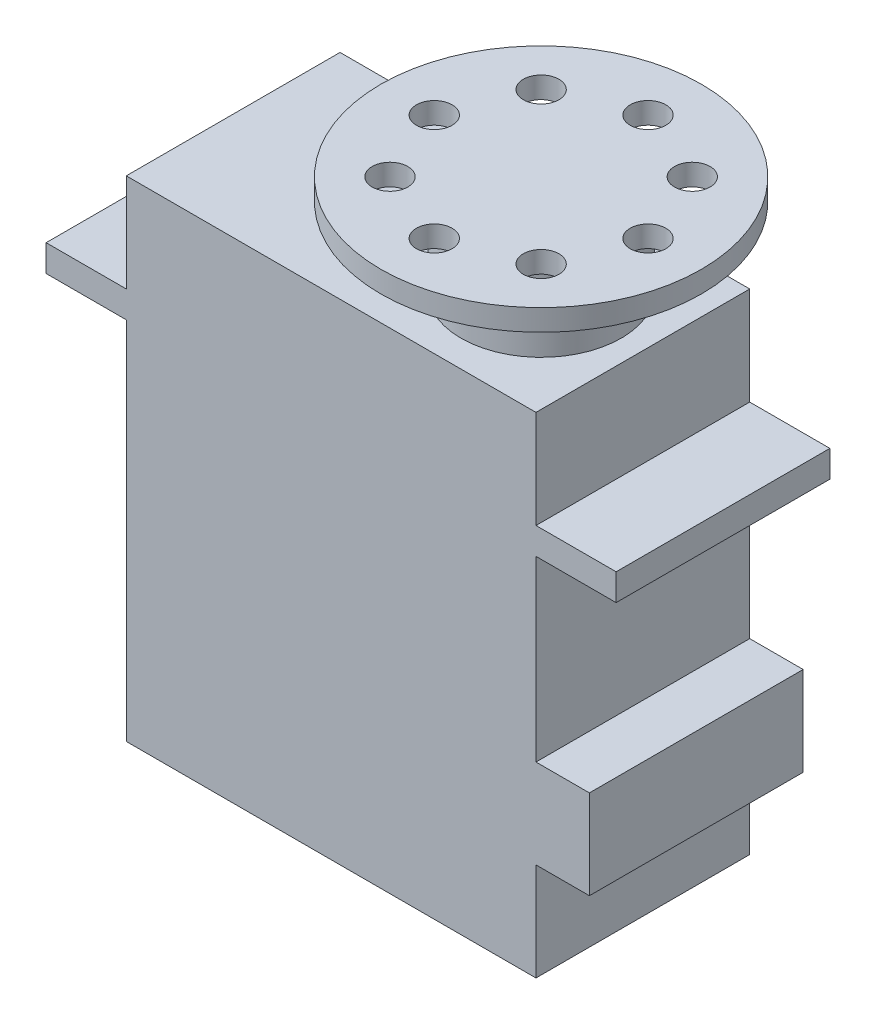
ISO-10303-21;
HEADER;
FILE_DESCRIPTION(('STEP AP214'),'2;1');
FILE_NAME('part.step','',(''),(''),'','','');
FILE_SCHEMA(('AUTOMOTIVE_DESIGN { 1 0 10303 214 1 1 1 1 }'));
ENDSEC;
DATA;
#1=APPLICATION_CONTEXT('core data for automotive mechanical design processes');
#2=APPLICATION_PROTOCOL_DEFINITION('international standard','automotive_design',2000,#1);
#3=PRODUCT_CONTEXT('',#1,'mechanical');
#4=PRODUCT('Part','Part','',(#3));
#5=PRODUCT_RELATED_PRODUCT_CATEGORY('part','',(#4));
#6=PRODUCT_DEFINITION_FORMATION('','',#4);
#7=PRODUCT_DEFINITION_CONTEXT('part definition',#1,'design');
#8=PRODUCT_DEFINITION('design','',#6,#7);
#9=PRODUCT_DEFINITION_SHAPE('','',#8);
#10=(LENGTH_UNIT() NAMED_UNIT(*) SI_UNIT(.MILLI.,.METRE.));
#11=(NAMED_UNIT(*) PLANE_ANGLE_UNIT() SI_UNIT($,.RADIAN.));
#12=(NAMED_UNIT(*) SI_UNIT($,.STERADIAN.) SOLID_ANGLE_UNIT());
#13=UNCERTAINTY_MEASURE_WITH_UNIT(LENGTH_MEASURE(1.E-05),#10,'distance_accuracy_value','');
#14=(GEOMETRIC_REPRESENTATION_CONTEXT(3) GLOBAL_UNCERTAINTY_ASSIGNED_CONTEXT((#13)) GLOBAL_UNIT_ASSIGNED_CONTEXT((#10,
#11,#12)) REPRESENTATION_CONTEXT('',''));
#15=CARTESIAN_POINT('',(0.,0.,0.));
#16=DIRECTION('',(0.,0.,1.));
#17=DIRECTION('',(1.,0.,0.));
#18=AXIS2_PLACEMENT_3D('',#15,#16,#17);
#19=CARTESIAN_POINT('',(11.5,13.75,-6.));
#20=DIRECTION('',(1.,0.,0.));
#21=DIRECTION('',(0.,0.,-1.));
#22=AXIS2_PLACEMENT_3D('',#19,#20,#21);
#23=PLANE('',#22);
#24=DIRECTION('',(0.,1.,0.));
#25=VECTOR('',#24,1.);
#26=CARTESIAN_POINT('',(11.5,13.75,-6.));
#27=LINE('',#26,#25);
#28=CARTESIAN_POINT('',(11.5,-13.75,-6.));
#29=VERTEX_POINT('',#28);
#30=CARTESIAN_POINT('',(11.5,-8.25,-6.));
#31=VERTEX_POINT('',#30);
#32=EDGE_CURVE('E358',#29,#31,#27,.T.);
#33=ORIENTED_EDGE('',*,*,#32,.T.);
#34=DIRECTION('',(0.,0.,-1.));
#35=VECTOR('',#34,1.);
#36=CARTESIAN_POINT('',(11.5,-8.25,6.));
#37=LINE('',#36,#35);
#38=CARTESIAN_POINT('',(11.5,-8.25,6.));
#39=VERTEX_POINT('',#38);
#40=EDGE_CURVE('E627',#39,#31,#37,.T.);
#41=ORIENTED_EDGE('',*,*,#40,.F.);
#42=DIRECTION('',(0.,1.,0.));
#43=VECTOR('',#42,1.);
#44=CARTESIAN_POINT('',(11.5,13.75,6.));
#45=LINE('',#44,#43);
#46=CARTESIAN_POINT('',(11.5,-13.75,6.));
#47=VERTEX_POINT('',#46);
#48=EDGE_CURVE('E185',#47,#39,#45,.T.);
#49=ORIENTED_EDGE('',*,*,#48,.F.);
#50=DIRECTION('',(0.,0.,1.));
#51=VECTOR('',#50,1.);
#52=CARTESIAN_POINT('',(11.5,-13.75,-6.));
#53=LINE('',#52,#51);
#54=EDGE_CURVE('E54',#29,#47,#53,.T.);
#55=ORIENTED_EDGE('',*,*,#54,.F.);
#56=EDGE_LOOP('',(#33,#41,#49,#55));
#57=FACE_BOUND('',#56,.T.);
#58=ADVANCED_FACE('F45',(#57),#23,.T.);
#59=CARTESIAN_POINT('',(11.5,-3.25,6.));
#60=VERTEX_POINT('',#59);
#61=CARTESIAN_POINT('',(11.5,6.75,6.));
#62=VERTEX_POINT('',#61);
#63=EDGE_CURVE('E345',#60,#62,#45,.T.);
#64=ORIENTED_EDGE('',*,*,#63,.F.);
#65=DIRECTION('',(0.,0.,1.));
#66=VECTOR('',#65,1.);
#67=CARTESIAN_POINT('',(11.5,-3.25,6.));
#68=LINE('',#67,#66);
#69=CARTESIAN_POINT('',(11.5,-3.25,-6.));
#70=VERTEX_POINT('',#69);
#71=EDGE_CURVE('E179',#70,#60,#68,.T.);
#72=ORIENTED_EDGE('',*,*,#71,.F.);
#73=CARTESIAN_POINT('',(11.5,6.75,-6.));
#74=VERTEX_POINT('',#73);
#75=EDGE_CURVE('E363',#70,#74,#27,.T.);
#76=ORIENTED_EDGE('',*,*,#75,.T.);
#77=DIRECTION('',(0.,0.,1.));
#78=VECTOR('',#77,1.);
#79=CARTESIAN_POINT('',(11.5,6.75,-6.));
#80=LINE('',#79,#78);
#81=EDGE_CURVE('E191',#74,#62,#80,.T.);
#82=ORIENTED_EDGE('',*,*,#81,.T.);
#83=EDGE_LOOP('',(#64,#72,#76,#82));
#84=FACE_BOUND('',#83,.T.);
#85=ADVANCED_FACE('F432',(#84),#23,.T.);
#86=CARTESIAN_POINT('',(11.5,8.25,6.));
#87=VERTEX_POINT('',#86);
#88=CARTESIAN_POINT('',(11.5,13.75,6.));
#89=VERTEX_POINT('',#88);
#90=EDGE_CURVE('E340',#87,#89,#45,.T.);
#91=ORIENTED_EDGE('',*,*,#90,.F.);
#92=DIRECTION('',(0.,0.,-1.));
#93=VECTOR('',#92,1.);
#94=CARTESIAN_POINT('',(11.5,8.25,6.));
#95=LINE('',#94,#93);
#96=CARTESIAN_POINT('',(11.5,8.25,-6.));
#97=VERTEX_POINT('',#96);
#98=EDGE_CURVE('E187',#87,#97,#95,.T.);
#99=ORIENTED_EDGE('',*,*,#98,.T.);
#100=CARTESIAN_POINT('',(11.5,13.75,-6.));
#101=VERTEX_POINT('',#100);
#102=EDGE_CURVE('E357',#97,#101,#27,.T.);
#103=ORIENTED_EDGE('',*,*,#102,.T.);
#104=DIRECTION('',(0.,0.,1.));
#105=VECTOR('',#104,1.);
#106=CARTESIAN_POINT('',(11.5,13.75,-6.));
#107=LINE('',#106,#105);
#108=EDGE_CURVE('E48',#101,#89,#107,.T.);
#109=ORIENTED_EDGE('',*,*,#108,.T.);
#110=EDGE_LOOP('',(#91,#99,#103,#109));
#111=FACE_BOUND('',#110,.T.);
#112=ADVANCED_FACE('F389',(#111),#23,.T.);
#113=CARTESIAN_POINT('',(-11.5,13.75,-6.));
#114=DIRECTION('',(-1.,0.,0.));
#115=DIRECTION('',(0.,0.,1.));
#116=AXIS2_PLACEMENT_3D('',#113,#114,#115);
#117=PLANE('',#116);
#118=DIRECTION('',(0.,0.,-1.));
#119=VECTOR('',#118,1.);
#120=CARTESIAN_POINT('',(-11.5,8.25,6.));
#121=LINE('',#120,#119);
#122=CARTESIAN_POINT('',(-11.5,8.25,6.));
#123=VERTEX_POINT('',#122);
#124=CARTESIAN_POINT('',(-11.5,8.25,-6.));
#125=VERTEX_POINT('',#124);
#126=EDGE_CURVE('E234',#123,#125,#121,.T.);
#127=ORIENTED_EDGE('',*,*,#126,.F.);
#128=DIRECTION('',(0.,-1.,0.));
#129=VECTOR('',#128,1.);
#130=CARTESIAN_POINT('',(-11.5,13.75,6.));
#131=LINE('',#130,#129);
#132=CARTESIAN_POINT('',(-11.5,13.75,6.));
#133=VERTEX_POINT('',#132);
#134=EDGE_CURVE('E350',#133,#123,#131,.T.);
#135=ORIENTED_EDGE('',*,*,#134,.F.);
#136=DIRECTION('',(0.,0.,1.));
#137=VECTOR('',#136,1.);
#138=CARTESIAN_POINT('',(-11.5,13.75,-6.));
#139=LINE('',#138,#137);
#140=CARTESIAN_POINT('',(-11.5,13.75,-6.));
#141=VERTEX_POINT('',#140);
#142=EDGE_CURVE('E380',#141,#133,#139,.T.);
#143=ORIENTED_EDGE('',*,*,#142,.F.);
#144=DIRECTION('',(0.,-1.,0.));
#145=VECTOR('',#144,1.);
#146=CARTESIAN_POINT('',(-11.5,13.75,-6.));
#147=LINE('',#146,#145);
#148=EDGE_CURVE('E368',#141,#125,#147,.T.);
#149=ORIENTED_EDGE('',*,*,#148,.T.);
#150=EDGE_LOOP('',(#127,#135,#143,#149));
#151=FACE_BOUND('',#150,.T.);
#152=ADVANCED_FACE('F396',(#151),#117,.T.);
#153=CARTESIAN_POINT('',(11.5,-13.75,-6.));
#154=DIRECTION('',(0.,-1.,0.));
#155=DIRECTION('',(0.,0.,-1.));
#156=AXIS2_PLACEMENT_3D('',#153,#154,#155);
#157=PLANE('',#156);
#158=ORIENTED_EDGE('',*,*,#54,.T.);
#159=DIRECTION('',(1.,0.,0.));
#160=VECTOR('',#159,1.);
#161=CARTESIAN_POINT('',(11.5,-13.75,6.));
#162=LINE('',#161,#160);
#163=CARTESIAN_POINT('',(-11.5,-13.75,6.));
#164=VERTEX_POINT('',#163);
#165=EDGE_CURVE('E354',#164,#47,#162,.T.);
#166=ORIENTED_EDGE('',*,*,#165,.F.);
#167=DIRECTION('',(0.,0.,1.));
#168=VECTOR('',#167,1.);
#169=CARTESIAN_POINT('',(-11.5,-13.75,-6.));
#170=LINE('',#169,#168);
#171=CARTESIAN_POINT('',(-11.5,-13.75,-6.));
#172=VERTEX_POINT('',#171);
#173=EDGE_CURVE('E377',#172,#164,#170,.T.);
#174=ORIENTED_EDGE('',*,*,#173,.F.);
#175=DIRECTION('',(1.,0.,0.));
#176=VECTOR('',#175,1.);
#177=CARTESIAN_POINT('',(11.5,-13.75,-6.));
#178=LINE('',#177,#176);
#179=EDGE_CURVE('E371',#172,#29,#178,.T.);
#180=ORIENTED_EDGE('',*,*,#179,.T.);
#181=EDGE_LOOP('',(#158,#166,#174,#180));
#182=FACE_BOUND('',#181,.T.);
#183=ADVANCED_FACE('F458',(#182),#157,.T.);
#184=DIRECTION('',(0.,0.,1.));
#185=VECTOR('',#184,1.);
#186=CARTESIAN_POINT('',(-11.5,6.75,-6.));
#187=LINE('',#186,#185);
#188=CARTESIAN_POINT('',(-11.5,6.75,-6.));
#189=VERTEX_POINT('',#188);
#190=CARTESIAN_POINT('',(-11.5,6.75,6.));
#191=VERTEX_POINT('',#190);
#192=EDGE_CURVE('E228',#189,#191,#187,.T.);
#193=ORIENTED_EDGE('',*,*,#192,.F.);
#194=EDGE_CURVE('E367',#189,#172,#147,.T.);
#195=ORIENTED_EDGE('',*,*,#194,.T.);
#196=ORIENTED_EDGE('',*,*,#173,.T.);
#197=EDGE_CURVE('E349',#191,#164,#131,.T.);
#198=ORIENTED_EDGE('',*,*,#197,.F.);
#199=EDGE_LOOP('',(#193,#195,#196,#198));
#200=FACE_BOUND('',#199,.T.);
#201=ADVANCED_FACE('F415',(#200),#117,.T.);
#202=CARTESIAN_POINT('',(11.5,13.75,-6.));
#203=DIRECTION('',(0.,1.,0.));
#204=DIRECTION('',(0.,0.,1.));
#205=AXIS2_PLACEMENT_3D('',#202,#203,#204);
#206=PLANE('',#205);
#207=CARTESIAN_POINT('',(5.79,13.75,0.));
#208=DIRECTION('',(0.,1.,0.));
#209=DIRECTION('',(0.,0.,1.));
#210=AXIS2_PLACEMENT_3D('',#207,#208,#209);
#211=CIRCLE('',#210,4.5);
#212=CARTESIAN_POINT('',(5.79,13.75,4.5));
#213=VERTEX_POINT('',#212);
#214=EDGE_CURVE('E11',#213,#213,#211,.T.);
#215=ORIENTED_EDGE('',*,*,#214,.F.);
#216=EDGE_LOOP('',(#215));
#217=FACE_BOUND('',#216,.T.);
#218=ORIENTED_EDGE('',*,*,#142,.T.);
#219=DIRECTION('',(-1.,0.,0.));
#220=VECTOR('',#219,1.);
#221=CARTESIAN_POINT('',(11.5,13.75,6.));
#222=LINE('',#221,#220);
#223=EDGE_CURVE('E344',#89,#133,#222,.T.);
#224=ORIENTED_EDGE('',*,*,#223,.F.);
#225=ORIENTED_EDGE('',*,*,#108,.F.);
#226=DIRECTION('',(-1.,0.,0.));
#227=VECTOR('',#226,1.);
#228=CARTESIAN_POINT('',(11.5,13.75,-6.));
#229=LINE('',#228,#227);
#230=EDGE_CURVE('E362',#101,#141,#229,.T.);
#231=ORIENTED_EDGE('',*,*,#230,.T.);
#232=EDGE_LOOP('',(#218,#224,#225,#231));
#233=FACE_BOUND('',#232,.T.);
#234=ADVANCED_FACE('F392',(#217,#233),#206,.T.);
#235=CARTESIAN_POINT('',(0.,0.,-6.));
#236=DIRECTION('',(0.,0.,-1.));
#237=DIRECTION('',(-1.,0.,0.));
#238=AXIS2_PLACEMENT_3D('',#235,#236,#237);
#239=PLANE('',#238);
#240=ORIENTED_EDGE('',*,*,#32,.F.);
#241=ORIENTED_EDGE('',*,*,#179,.F.);
#242=ORIENTED_EDGE('',*,*,#194,.F.);
#243=DIRECTION('',(1.,0.,0.));
#244=VECTOR('',#243,1.);
#245=CARTESIAN_POINT('',(-16.,6.75,-6.));
#246=LINE('',#245,#244);
#247=CARTESIAN_POINT('',(-16.,6.75,-6.));
#248=VERTEX_POINT('',#247);
#249=EDGE_CURVE('E261',#248,#189,#246,.T.);
#250=ORIENTED_EDGE('',*,*,#249,.F.);
#251=DIRECTION('',(0.,-1.,0.));
#252=VECTOR('',#251,1.);
#253=CARTESIAN_POINT('',(-16.,8.25,-6.));
#254=LINE('',#253,#252);
#255=CARTESIAN_POINT('',(-16.,8.25,-6.));
#256=VERTEX_POINT('',#255);
#257=EDGE_CURVE('E229',#256,#248,#254,.T.);
#258=ORIENTED_EDGE('',*,*,#257,.F.);
#259=DIRECTION('',(1.,0.,0.));
#260=VECTOR('',#259,1.);
#261=CARTESIAN_POINT('',(-16.,8.25,-6.));
#262=LINE('',#261,#260);
#263=EDGE_CURVE('E243',#256,#125,#262,.T.);
#264=ORIENTED_EDGE('',*,*,#263,.T.);
#265=ORIENTED_EDGE('',*,*,#148,.F.);
#266=ORIENTED_EDGE('',*,*,#230,.F.);
#267=ORIENTED_EDGE('',*,*,#102,.F.);
#268=DIRECTION('',(-1.,0.,0.));
#269=VECTOR('',#268,1.);
#270=CARTESIAN_POINT('',(16.,8.25,-6.));
#271=LINE('',#270,#269);
#272=CARTESIAN_POINT('',(16.,8.25,-6.));
#273=VERTEX_POINT('',#272);
#274=EDGE_CURVE('E70',#273,#97,#271,.T.);
#275=ORIENTED_EDGE('',*,*,#274,.F.);
#276=DIRECTION('',(0.,-1.,0.));
#277=VECTOR('',#276,1.);
#278=CARTESIAN_POINT('',(16.,8.25,-6.));
#279=LINE('',#278,#277);
#280=CARTESIAN_POINT('',(16.,6.75,-6.));
#281=VERTEX_POINT('',#280);
#282=EDGE_CURVE('E197',#273,#281,#279,.T.);
#283=ORIENTED_EDGE('',*,*,#282,.T.);
#284=DIRECTION('',(-1.,0.,0.));
#285=VECTOR('',#284,1.);
#286=CARTESIAN_POINT('',(16.,6.75,-6.));
#287=LINE('',#286,#285);
#288=EDGE_CURVE('E211',#281,#74,#287,.T.);
#289=ORIENTED_EDGE('',*,*,#288,.T.);
#290=ORIENTED_EDGE('',*,*,#75,.F.);
#291=DIRECTION('',(-1.,0.,0.));
#292=VECTOR('',#291,1.);
#293=CARTESIAN_POINT('',(14.5,-3.25,-6.));
#294=LINE('',#293,#292);
#295=CARTESIAN_POINT('',(14.5,-3.25,-6.));
#296=VERTEX_POINT('',#295);
#297=EDGE_CURVE('E193',#296,#70,#294,.T.);
#298=ORIENTED_EDGE('',*,*,#297,.F.);
#299=DIRECTION('',(0.,1.,0.));
#300=VECTOR('',#299,1.);
#301=CARTESIAN_POINT('',(14.5,-8.25,-6.));
#302=LINE('',#301,#300);
#303=CARTESIAN_POINT('',(14.5,-8.25,-6.));
#304=VERTEX_POINT('',#303);
#305=EDGE_CURVE('E172',#304,#296,#302,.T.);
#306=ORIENTED_EDGE('',*,*,#305,.F.);
#307=DIRECTION('',(-1.,0.,0.));
#308=VECTOR('',#307,1.);
#309=CARTESIAN_POINT('',(14.5,-8.25,-6.));
#310=LINE('',#309,#308);
#311=EDGE_CURVE('E168',#304,#31,#310,.T.);
#312=ORIENTED_EDGE('',*,*,#311,.T.);
#313=EDGE_LOOP('',(#240,#241,#242,#250,#258,#264,#265,#266,#267,#275,#283,#289,#290,#298,#306,#312));
#314=FACE_BOUND('',#313,.T.);
#315=ADVANCED_FACE('F405',(#314),#239,.T.);
#316=CARTESIAN_POINT('',(0.,0.,6.));
#317=DIRECTION('',(0.,0.,-1.));
#318=DIRECTION('',(-1.,0.,0.));
#319=AXIS2_PLACEMENT_3D('',#316,#317,#318);
#320=PLANE('',#319);
#321=ORIENTED_EDGE('',*,*,#48,.T.);
#322=DIRECTION('',(-1.,0.,0.));
#323=VECTOR('',#322,1.);
#324=CARTESIAN_POINT('',(14.5,-8.25,6.));
#325=LINE('',#324,#323);
#326=CARTESIAN_POINT('',(14.5,-8.25,6.));
#327=VERTEX_POINT('',#326);
#328=EDGE_CURVE('E165',#327,#39,#325,.T.);
#329=ORIENTED_EDGE('',*,*,#328,.F.);
#330=DIRECTION('',(0.,-1.,0.));
#331=VECTOR('',#330,1.);
#332=CARTESIAN_POINT('',(14.5,-8.25,6.));
#333=LINE('',#332,#331);
#334=CARTESIAN_POINT('',(14.5,-3.25,6.));
#335=VERTEX_POINT('',#334);
#336=EDGE_CURVE('E173',#335,#327,#333,.T.);
#337=ORIENTED_EDGE('',*,*,#336,.F.);
#338=DIRECTION('',(-1.,0.,0.));
#339=VECTOR('',#338,1.);
#340=CARTESIAN_POINT('',(14.5,-3.25,6.));
#341=LINE('',#340,#339);
#342=EDGE_CURVE('E62',#335,#60,#341,.T.);
#343=ORIENTED_EDGE('',*,*,#342,.T.);
#344=ORIENTED_EDGE('',*,*,#63,.T.);
#345=DIRECTION('',(-1.,0.,0.));
#346=VECTOR('',#345,1.);
#347=CARTESIAN_POINT('',(16.,6.75,6.));
#348=LINE('',#347,#346);
#349=CARTESIAN_POINT('',(16.,6.75,6.));
#350=VERTEX_POINT('',#349);
#351=EDGE_CURVE('E219',#350,#62,#348,.T.);
#352=ORIENTED_EDGE('',*,*,#351,.F.);
#353=DIRECTION('',(0.,1.,0.));
#354=VECTOR('',#353,1.);
#355=CARTESIAN_POINT('',(16.,8.25,6.));
#356=LINE('',#355,#354);
#357=CARTESIAN_POINT('',(16.,8.25,6.));
#358=VERTEX_POINT('',#357);
#359=EDGE_CURVE('E204',#350,#358,#356,.T.);
#360=ORIENTED_EDGE('',*,*,#359,.T.);
#361=DIRECTION('',(-1.,0.,0.));
#362=VECTOR('',#361,1.);
#363=CARTESIAN_POINT('',(16.,8.25,6.));
#364=LINE('',#363,#362);
#365=EDGE_CURVE('E223',#358,#87,#364,.T.);
#366=ORIENTED_EDGE('',*,*,#365,.T.);
#367=ORIENTED_EDGE('',*,*,#90,.T.);
#368=ORIENTED_EDGE('',*,*,#223,.T.);
#369=ORIENTED_EDGE('',*,*,#134,.T.);
#370=DIRECTION('',(1.,0.,0.));
#371=VECTOR('',#370,1.);
#372=CARTESIAN_POINT('',(-16.,8.25,6.));
#373=LINE('',#372,#371);
#374=CARTESIAN_POINT('',(-16.,8.25,6.));
#375=VERTEX_POINT('',#374);
#376=EDGE_CURVE('E253',#375,#123,#373,.T.);
#377=ORIENTED_EDGE('',*,*,#376,.F.);
#378=DIRECTION('',(0.,1.,0.));
#379=VECTOR('',#378,1.);
#380=CARTESIAN_POINT('',(-16.,8.25,6.));
#381=LINE('',#380,#379);
#382=CARTESIAN_POINT('',(-16.,6.75,6.));
#383=VERTEX_POINT('',#382);
#384=EDGE_CURVE('E237',#383,#375,#381,.T.);
#385=ORIENTED_EDGE('',*,*,#384,.F.);
#386=DIRECTION('',(1.,0.,0.));
#387=VECTOR('',#386,1.);
#388=CARTESIAN_POINT('',(-16.,6.75,6.));
#389=LINE('',#388,#387);
#390=EDGE_CURVE('E257',#383,#191,#389,.T.);
#391=ORIENTED_EDGE('',*,*,#390,.T.);
#392=ORIENTED_EDGE('',*,*,#197,.T.);
#393=ORIENTED_EDGE('',*,*,#165,.T.);
#394=EDGE_LOOP('',(#321,#329,#337,#343,#344,#352,#360,#366,#367,#368,#369,#377,#385,#391,#392,#393));
#395=FACE_BOUND('',#394,.T.);
#396=ADVANCED_FACE('F182',(#395),#320,.F.);
#397=CARTESIAN_POINT('',(5.79,18.15,0.));
#398=DIRECTION('',(0.,-1.,0.));
#399=DIRECTION('',(0.,0.,-1.));
#400=AXIS2_PLACEMENT_3D('',#397,#398,#399);
#401=CYLINDRICAL_SURFACE('',#400,4.5);
#402=CARTESIAN_POINT('',(5.79,18.15,0.));
#403=DIRECTION('',(0.,1.,0.));
#404=DIRECTION('',(0.,0.,1.));
#405=AXIS2_PLACEMENT_3D('',#402,#403,#404);
#406=CIRCLE('',#405,4.5);
#407=CARTESIAN_POINT('',(5.79,18.15,4.5));
#408=VERTEX_POINT('',#407);
#409=EDGE_CURVE('E334',#408,#408,#406,.T.);
#410=ORIENTED_EDGE('',*,*,#409,.F.);
#411=EDGE_LOOP('',(#410));
#412=FACE_BOUND('',#411,.T.);
#413=ORIENTED_EDGE('',*,*,#214,.T.);
#414=EDGE_LOOP('',(#413));
#415=FACE_BOUND('',#414,.T.);
#416=ADVANCED_FACE('F479',(#412,#415),#401,.T.);
#417=CARTESIAN_POINT('',(5.79,19.35,0.));
#418=DIRECTION('',(0.,-1.,0.));
#419=DIRECTION('',(0.,0.,-1.));
#420=AXIS2_PLACEMENT_3D('',#417,#418,#419);
#421=CYLINDRICAL_SURFACE('',#420,9.);
#422=CARTESIAN_POINT('',(5.79,19.35,0.));
#423=DIRECTION('',(0.,1.,0.));
#424=DIRECTION('',(0.,0.,1.));
#425=AXIS2_PLACEMENT_3D('',#422,#423,#424);
#426=CIRCLE('',#425,9.);
#427=CARTESIAN_POINT('',(5.79,19.35,9.));
#428=VERTEX_POINT('',#427);
#429=EDGE_CURVE('E330',#428,#428,#426,.T.);
#430=ORIENTED_EDGE('',*,*,#429,.F.);
#431=EDGE_LOOP('',(#430));
#432=FACE_BOUND('',#431,.T.);
#433=CARTESIAN_POINT('',(5.79,18.15,0.));
#434=DIRECTION('',(0.,1.,0.));
#435=DIRECTION('',(0.,0.,1.));
#436=AXIS2_PLACEMENT_3D('',#433,#434,#435);
#437=CIRCLE('',#436,9.);
#438=CARTESIAN_POINT('',(5.79,18.15,9.));
#439=VERTEX_POINT('',#438);
#440=EDGE_CURVE('E329',#439,#439,#437,.T.);
#441=ORIENTED_EDGE('',*,*,#440,.T.);
#442=EDGE_LOOP('',(#441));
#443=FACE_BOUND('',#442,.T.);
#444=ADVANCED_FACE('F480',(#432,#443),#421,.T.);
#445=CARTESIAN_POINT('',(5.79,19.35,0.));
#446=DIRECTION('',(0.,1.,0.));
#447=DIRECTION('',(0.,0.,1.));
#448=AXIS2_PLACEMENT_3D('',#445,#446,#447);
#449=PLANE('',#448);
#450=CARTESIAN_POINT('',(1.54735931288089,19.35,-4.24264068711904));
#451=DIRECTION('',(0.,1.,0.));
#452=DIRECTION('',(0.,0.,1.));
#453=AXIS2_PLACEMENT_3D('',#450,#451,#452);
#454=CIRCLE('',#453,0.999999999999999);
#455=CARTESIAN_POINT('',(1.54735931288089,19.35,-3.24264068711904));
#456=VERTEX_POINT('',#455);
#457=EDGE_CURVE('E312',#456,#456,#454,.T.);
#458=ORIENTED_EDGE('',*,*,#457,.F.);
#459=EDGE_LOOP('',(#458));
#460=FACE_BOUND('',#459,.T.);
#461=CARTESIAN_POINT('',(-0.209999999999574,19.35,3.62557206479153E-13));
#462=DIRECTION('',(0.,1.,0.));
#463=DIRECTION('',(0.,0.,1.));
#464=AXIS2_PLACEMENT_3D('',#461,#462,#463);
#465=CIRCLE('',#464,1.);
#466=CARTESIAN_POINT('',(-0.209999999999574,19.35,1.00000000000036));
#467=VERTEX_POINT('',#466);
#468=EDGE_CURVE('E304',#467,#467,#465,.T.);
#469=ORIENTED_EDGE('',*,*,#468,.F.);
#470=EDGE_LOOP('',(#469));
#471=FACE_BOUND('',#470,.T.);
#472=CARTESIAN_POINT('',(1.5473593128814,19.35,4.24264068711955));
#473=DIRECTION('',(0.,1.,0.));
#474=DIRECTION('',(0.,0.,1.));
#475=AXIS2_PLACEMENT_3D('',#472,#473,#474);
#476=CIRCLE('',#475,1.);
#477=CARTESIAN_POINT('',(1.5473593128814,19.35,5.24264068711955));
#478=VERTEX_POINT('',#477);
#479=EDGE_CURVE('E296',#478,#478,#476,.T.);
#480=ORIENTED_EDGE('',*,*,#479,.F.);
#481=EDGE_LOOP('',(#480));
#482=FACE_BOUND('',#481,.T.);
#483=CARTESIAN_POINT('',(5.79000000000081,19.35,6.));
#484=DIRECTION('',(0.,1.,0.));
#485=DIRECTION('',(0.,0.,1.));
#486=AXIS2_PLACEMENT_3D('',#483,#484,#485);
#487=CIRCLE('',#486,1.);
#488=CARTESIAN_POINT('',(5.79000000000081,19.35,7.));
#489=VERTEX_POINT('',#488);
#490=EDGE_CURVE('E288',#489,#489,#487,.T.);
#491=ORIENTED_EDGE('',*,*,#490,.F.);
#492=EDGE_LOOP('',(#491));
#493=FACE_BOUND('',#492,.T.);
#494=CARTESIAN_POINT('',(10.03264068712,19.35,4.24264068711901));
#495=DIRECTION('',(0.,1.,0.));
#496=DIRECTION('',(0.,0.,1.));
#497=AXIS2_PLACEMENT_3D('',#494,#495,#496);
#498=CIRCLE('',#497,0.999999999999998);
#499=CARTESIAN_POINT('',(10.03264068712,19.35,5.24264068711901));
#500=VERTEX_POINT('',#499);
#501=EDGE_CURVE('E280',#500,#500,#498,.T.);
#502=ORIENTED_EDGE('',*,*,#501,.F.);
#503=EDGE_LOOP('',(#502));
#504=FACE_BOUND('',#503,.T.);
#505=CARTESIAN_POINT('',(11.7900000000004,19.35,-4.04190569902596E-13));
#506=DIRECTION('',(0.,1.,0.));
#507=DIRECTION('',(0.,0.,1.));
#508=AXIS2_PLACEMENT_3D('',#505,#506,#507);
#509=CIRCLE('',#508,0.999999999999999);
#510=CARTESIAN_POINT('',(11.7900000000004,19.35,0.999999999999595));
#511=VERTEX_POINT('',#510);
#512=EDGE_CURVE('E271',#511,#511,#509,.T.);
#513=ORIENTED_EDGE('',*,*,#512,.F.);
#514=EDGE_LOOP('',(#513));
#515=FACE_BOUND('',#514,.T.);
#516=CARTESIAN_POINT('',(10.0326406871194,19.35,-4.24264068711958));
#517=DIRECTION('',(0.,1.,0.));
#518=DIRECTION('',(0.,0.,1.));
#519=AXIS2_PLACEMENT_3D('',#516,#517,#518);
#520=CIRCLE('',#519,1.);
#521=CARTESIAN_POINT('',(10.0326406871194,19.35,-3.24264068711958));
#522=VERTEX_POINT('',#521);
#523=EDGE_CURVE('E270',#522,#522,#520,.T.);
#524=ORIENTED_EDGE('',*,*,#523,.F.);
#525=EDGE_LOOP('',(#524));
#526=FACE_BOUND('',#525,.T.);
#527=CARTESIAN_POINT('',(5.79,19.35,-6.));
#528=DIRECTION('',(0.,1.,0.));
#529=DIRECTION('',(0.,0.,1.));
#530=AXIS2_PLACEMENT_3D('',#527,#528,#529);
#531=CIRCLE('',#530,1.);
#532=CARTESIAN_POINT('',(5.79,19.35,-5.));
#533=VERTEX_POINT('',#532);
#534=EDGE_CURVE('E275',#533,#533,#531,.T.);
#535=ORIENTED_EDGE('',*,*,#534,.F.);
#536=EDGE_LOOP('',(#535));
#537=FACE_BOUND('',#536,.T.);
#538=ORIENTED_EDGE('',*,*,#429,.T.);
#539=EDGE_LOOP('',(#538));
#540=FACE_BOUND('',#539,.T.);
#541=ADVANCED_FACE('F486',(#460,#471,#482,#493,#504,#515,#526,#537,#540),#449,.T.);
#542=CARTESIAN_POINT('',(5.79,18.15,0.));
#543=DIRECTION('',(0.,1.,0.));
#544=DIRECTION('',(0.,0.,1.));
#545=AXIS2_PLACEMENT_3D('',#542,#543,#544);
#546=PLANE('',#545);
#547=CARTESIAN_POINT('',(1.54735931288089,18.15,-4.24264068711904));
#548=DIRECTION('',(0.,1.,0.));
#549=DIRECTION('',(0.,0.,1.));
#550=AXIS2_PLACEMENT_3D('',#547,#548,#549);
#551=CIRCLE('',#550,0.999999999999999);
#552=CARTESIAN_POINT('',(1.54735931288089,18.15,-3.24264068711904));
#553=VERTEX_POINT('',#552);
#554=EDGE_CURVE('E265',#553,#553,#551,.F.);
#555=ORIENTED_EDGE('',*,*,#554,.F.);
#556=EDGE_LOOP('',(#555));
#557=FACE_BOUND('',#556,.T.);
#558=CARTESIAN_POINT('',(-0.209999999999574,18.15,3.62557206479153E-13));
#559=DIRECTION('',(0.,1.,0.));
#560=DIRECTION('',(0.,0.,1.));
#561=AXIS2_PLACEMENT_3D('',#558,#559,#560);
#562=CIRCLE('',#561,1.);
#563=CARTESIAN_POINT('',(-0.209999999999574,18.15,1.00000000000036));
#564=VERTEX_POINT('',#563);
#565=EDGE_CURVE('E308',#564,#564,#562,.F.);
#566=ORIENTED_EDGE('',*,*,#565,.F.);
#567=EDGE_LOOP('',(#566));
#568=FACE_BOUND('',#567,.T.);
#569=CARTESIAN_POINT('',(1.5473593128814,18.15,4.24264068711955));
#570=DIRECTION('',(0.,1.,0.));
#571=DIRECTION('',(0.,0.,1.));
#572=AXIS2_PLACEMENT_3D('',#569,#570,#571);
#573=CIRCLE('',#572,1.);
#574=CARTESIAN_POINT('',(1.5473593128814,18.15,5.24264068711955));
#575=VERTEX_POINT('',#574);
#576=EDGE_CURVE('E300',#575,#575,#573,.F.);
#577=ORIENTED_EDGE('',*,*,#576,.F.);
#578=EDGE_LOOP('',(#577));
#579=FACE_BOUND('',#578,.T.);
#580=CARTESIAN_POINT('',(5.79000000000081,18.15,6.));
#581=DIRECTION('',(0.,1.,0.));
#582=DIRECTION('',(0.,0.,1.));
#583=AXIS2_PLACEMENT_3D('',#580,#581,#582);
#584=CIRCLE('',#583,1.);
#585=CARTESIAN_POINT('',(5.79000000000081,18.15,7.));
#586=VERTEX_POINT('',#585);
#587=EDGE_CURVE('E292',#586,#586,#584,.F.);
#588=ORIENTED_EDGE('',*,*,#587,.F.);
#589=EDGE_LOOP('',(#588));
#590=FACE_BOUND('',#589,.T.);
#591=CARTESIAN_POINT('',(10.03264068712,18.15,4.24264068711901));
#592=DIRECTION('',(0.,1.,0.));
#593=DIRECTION('',(0.,0.,1.));
#594=AXIS2_PLACEMENT_3D('',#591,#592,#593);
#595=CIRCLE('',#594,0.999999999999998);
#596=CARTESIAN_POINT('',(10.03264068712,18.15,5.24264068711901));
#597=VERTEX_POINT('',#596);
#598=EDGE_CURVE('E284',#597,#597,#595,.F.);
#599=ORIENTED_EDGE('',*,*,#598,.F.);
#600=EDGE_LOOP('',(#599));
#601=FACE_BOUND('',#600,.T.);
#602=CARTESIAN_POINT('',(11.7900000000004,18.15,-4.04190569902596E-13));
#603=DIRECTION('',(0.,1.,0.));
#604=DIRECTION('',(0.,0.,1.));
#605=AXIS2_PLACEMENT_3D('',#602,#603,#604);
#606=CIRCLE('',#605,0.999999999999999);
#607=CARTESIAN_POINT('',(11.7900000000004,18.15,0.999999999999595));
#608=VERTEX_POINT('',#607);
#609=EDGE_CURVE('E276',#608,#608,#606,.F.);
#610=ORIENTED_EDGE('',*,*,#609,.F.);
#611=EDGE_LOOP('',(#610));
#612=FACE_BOUND('',#611,.T.);
#613=CARTESIAN_POINT('',(10.0326406871194,18.15,-4.24264068711958));
#614=DIRECTION('',(0.,1.,0.));
#615=DIRECTION('',(0.,0.,1.));
#616=AXIS2_PLACEMENT_3D('',#613,#614,#615);
#617=CIRCLE('',#616,1.);
#618=CARTESIAN_POINT('',(10.0326406871194,18.15,-3.24264068711958));
#619=VERTEX_POINT('',#618);
#620=EDGE_CURVE('E266',#619,#619,#617,.F.);
#621=ORIENTED_EDGE('',*,*,#620,.F.);
#622=EDGE_LOOP('',(#621));
#623=FACE_BOUND('',#622,.T.);
#624=CARTESIAN_POINT('',(5.79,18.15,-6.));
#625=DIRECTION('',(0.,1.,0.));
#626=DIRECTION('',(0.,0.,1.));
#627=AXIS2_PLACEMENT_3D('',#624,#625,#626);
#628=CIRCLE('',#627,1.);
#629=CARTESIAN_POINT('',(5.79,18.15,-5.));
#630=VERTEX_POINT('',#629);
#631=EDGE_CURVE('E325',#630,#630,#628,.F.);
#632=ORIENTED_EDGE('',*,*,#631,.F.);
#633=EDGE_LOOP('',(#632));
#634=FACE_BOUND('',#633,.T.);
#635=ORIENTED_EDGE('',*,*,#409,.T.);
#636=EDGE_LOOP('',(#635));
#637=FACE_BOUND('',#636,.T.);
#638=ORIENTED_EDGE('',*,*,#440,.F.);
#639=EDGE_LOOP('',(#638));
#640=FACE_BOUND('',#639,.T.);
#641=ADVANCED_FACE('F493',(#557,#568,#579,#590,#601,#612,#623,#634,#637,#640),#546,.F.);
#642=CARTESIAN_POINT('',(5.79,15.3215728752538,-6.));
#643=DIRECTION('',(0.,1.,0.));
#644=DIRECTION('',(0.,0.,1.));
#645=AXIS2_PLACEMENT_3D('',#642,#643,#644);
#646=CYLINDRICAL_SURFACE('',#645,1.);
#647=ORIENTED_EDGE('',*,*,#631,.T.);
#648=EDGE_LOOP('',(#647));
#649=FACE_BOUND('',#648,.T.);
#650=ORIENTED_EDGE('',*,*,#534,.T.);
#651=EDGE_LOOP('',(#650));
#652=FACE_BOUND('',#651,.T.);
#653=ADVANCED_FACE('F496',(#649,#652),#646,.F.);
#654=CARTESIAN_POINT('',(10.0326406871194,15.3215728752538,-4.24264068711958));
#655=DIRECTION('',(0.,1.,0.));
#656=DIRECTION('',(0.,0.,1.));
#657=AXIS2_PLACEMENT_3D('',#654,#655,#656);
#658=CYLINDRICAL_SURFACE('',#657,1.);
#659=ORIENTED_EDGE('',*,*,#620,.T.);
#660=EDGE_LOOP('',(#659));
#661=FACE_BOUND('',#660,.T.);
#662=ORIENTED_EDGE('',*,*,#523,.T.);
#663=EDGE_LOOP('',(#662));
#664=FACE_BOUND('',#663,.T.);
#665=ADVANCED_FACE('F503',(#661,#664),#658,.F.);
#666=CARTESIAN_POINT('',(11.7900000000004,15.3215728752538,-4.04190569902596E-13));
#667=DIRECTION('',(0.,1.,0.));
#668=DIRECTION('',(0.,0.,1.));
#669=AXIS2_PLACEMENT_3D('',#666,#667,#668);
#670=CYLINDRICAL_SURFACE('',#669,0.999999999999999);
#671=ORIENTED_EDGE('',*,*,#609,.T.);
#672=EDGE_LOOP('',(#671));
#673=FACE_BOUND('',#672,.T.);
#674=ORIENTED_EDGE('',*,*,#512,.T.);
#675=EDGE_LOOP('',(#674));
#676=FACE_BOUND('',#675,.T.);
#677=ADVANCED_FACE('F523',(#673,#676),#670,.F.);
#678=CARTESIAN_POINT('',(10.03264068712,15.3215728752538,4.24264068711901));
#679=DIRECTION('',(0.,1.,0.));
#680=DIRECTION('',(0.,0.,1.));
#681=AXIS2_PLACEMENT_3D('',#678,#679,#680);
#682=CYLINDRICAL_SURFACE('',#681,0.999999999999998);
#683=ORIENTED_EDGE('',*,*,#598,.T.);
#684=EDGE_LOOP('',(#683));
#685=FACE_BOUND('',#684,.T.);
#686=ORIENTED_EDGE('',*,*,#501,.T.);
#687=EDGE_LOOP('',(#686));
#688=FACE_BOUND('',#687,.T.);
#689=ADVANCED_FACE('F519',(#685,#688),#682,.F.);
#690=CARTESIAN_POINT('',(5.79000000000081,15.3215728752538,6.));
#691=DIRECTION('',(0.,1.,0.));
#692=DIRECTION('',(0.,0.,1.));
#693=AXIS2_PLACEMENT_3D('',#690,#691,#692);
#694=CYLINDRICAL_SURFACE('',#693,1.);
#695=ORIENTED_EDGE('',*,*,#587,.T.);
#696=EDGE_LOOP('',(#695));
#697=FACE_BOUND('',#696,.T.);
#698=ORIENTED_EDGE('',*,*,#490,.T.);
#699=EDGE_LOOP('',(#698));
#700=FACE_BOUND('',#699,.T.);
#701=ADVANCED_FACE('F515',(#697,#700),#694,.F.);
#702=CARTESIAN_POINT('',(1.5473593128814,15.3215728752538,4.24264068711955));
#703=DIRECTION('',(0.,1.,0.));
#704=DIRECTION('',(0.,0.,1.));
#705=AXIS2_PLACEMENT_3D('',#702,#703,#704);
#706=CYLINDRICAL_SURFACE('',#705,1.);
#707=ORIENTED_EDGE('',*,*,#576,.T.);
#708=EDGE_LOOP('',(#707));
#709=FACE_BOUND('',#708,.T.);
#710=ORIENTED_EDGE('',*,*,#479,.T.);
#711=EDGE_LOOP('',(#710));
#712=FACE_BOUND('',#711,.T.);
#713=ADVANCED_FACE('F511',(#709,#712),#706,.F.);
#714=CARTESIAN_POINT('',(-0.209999999999574,15.3215728752538,3.62557206479153E-13));
#715=DIRECTION('',(0.,1.,0.));
#716=DIRECTION('',(0.,0.,1.));
#717=AXIS2_PLACEMENT_3D('',#714,#715,#716);
#718=CYLINDRICAL_SURFACE('',#717,1.);
#719=ORIENTED_EDGE('',*,*,#565,.T.);
#720=EDGE_LOOP('',(#719));
#721=FACE_BOUND('',#720,.T.);
#722=ORIENTED_EDGE('',*,*,#468,.T.);
#723=EDGE_LOOP('',(#722));
#724=FACE_BOUND('',#723,.T.);
#725=ADVANCED_FACE('F507',(#721,#724),#718,.F.);
#726=CARTESIAN_POINT('',(1.54735931288089,15.3215728752538,-4.24264068711904));
#727=DIRECTION('',(0.,1.,0.));
#728=DIRECTION('',(0.,0.,1.));
#729=AXIS2_PLACEMENT_3D('',#726,#727,#728);
#730=CYLINDRICAL_SURFACE('',#729,0.999999999999999);
#731=ORIENTED_EDGE('',*,*,#554,.T.);
#732=EDGE_LOOP('',(#731));
#733=FACE_BOUND('',#732,.T.);
#734=ORIENTED_EDGE('',*,*,#457,.T.);
#735=EDGE_LOOP('',(#734));
#736=FACE_BOUND('',#735,.T.);
#737=ADVANCED_FACE('F505',(#733,#736),#730,.F.);
#738=CARTESIAN_POINT('',(-16.,6.75,-6.));
#739=DIRECTION('',(0.,1.,0.));
#740=DIRECTION('',(0.,0.,1.));
#741=AXIS2_PLACEMENT_3D('',#738,#739,#740);
#742=PLANE('',#741);
#743=ORIENTED_EDGE('',*,*,#192,.T.);
#744=ORIENTED_EDGE('',*,*,#390,.F.);
#745=DIRECTION('',(0.,0.,1.));
#746=VECTOR('',#745,1.);
#747=CARTESIAN_POINT('',(-16.,6.75,-6.));
#748=LINE('',#747,#746);
#749=EDGE_CURVE('E233',#248,#383,#748,.T.);
#750=ORIENTED_EDGE('',*,*,#749,.F.);
#751=ORIENTED_EDGE('',*,*,#249,.T.);
#752=EDGE_LOOP('',(#743,#744,#750,#751));
#753=FACE_BOUND('',#752,.T.);
#754=ADVANCED_FACE('F413',(#753),#742,.F.);
#755=CARTESIAN_POINT('',(-16.,8.25,6.));
#756=DIRECTION('',(0.,-1.,0.));
#757=DIRECTION('',(0.,0.,-1.));
#758=AXIS2_PLACEMENT_3D('',#755,#756,#757);
#759=PLANE('',#758);
#760=ORIENTED_EDGE('',*,*,#126,.T.);
#761=ORIENTED_EDGE('',*,*,#263,.F.);
#762=DIRECTION('',(0.,0.,-1.));
#763=VECTOR('',#762,1.);
#764=CARTESIAN_POINT('',(-16.,8.25,6.));
#765=LINE('',#764,#763);
#766=EDGE_CURVE('E240',#375,#256,#765,.T.);
#767=ORIENTED_EDGE('',*,*,#766,.F.);
#768=ORIENTED_EDGE('',*,*,#376,.T.);
#769=EDGE_LOOP('',(#760,#761,#767,#768));
#770=FACE_BOUND('',#769,.T.);
#771=ADVANCED_FACE('F400',(#770),#759,.F.);
#772=CARTESIAN_POINT('',(-16.,0.,0.));
#773=DIRECTION('',(-1.,0.,0.));
#774=DIRECTION('',(0.,0.,1.));
#775=AXIS2_PLACEMENT_3D('',#772,#773,#774);
#776=PLANE('',#775);
#777=ORIENTED_EDGE('',*,*,#257,.T.);
#778=ORIENTED_EDGE('',*,*,#749,.T.);
#779=ORIENTED_EDGE('',*,*,#384,.T.);
#780=ORIENTED_EDGE('',*,*,#766,.T.);
#781=EDGE_LOOP('',(#777,#778,#779,#780));
#782=FACE_BOUND('',#781,.T.);
#783=ADVANCED_FACE('F409',(#782),#776,.T.);
#784=CARTESIAN_POINT('',(16.,8.25,6.));
#785=DIRECTION('',(0.,1.,0.));
#786=DIRECTION('',(0.,0.,1.));
#787=AXIS2_PLACEMENT_3D('',#784,#785,#786);
#788=PLANE('',#787);
#789=ORIENTED_EDGE('',*,*,#98,.F.);
#790=ORIENTED_EDGE('',*,*,#365,.F.);
#791=DIRECTION('',(0.,0.,-1.));
#792=VECTOR('',#791,1.);
#793=CARTESIAN_POINT('',(16.,8.25,6.));
#794=LINE('',#793,#792);
#795=EDGE_CURVE('E201',#358,#273,#794,.T.);
#796=ORIENTED_EDGE('',*,*,#795,.T.);
#797=ORIENTED_EDGE('',*,*,#274,.T.);
#798=EDGE_LOOP('',(#789,#790,#796,#797));
#799=FACE_BOUND('',#798,.T.);
#800=ADVANCED_FACE('F439',(#799),#788,.T.);
#801=CARTESIAN_POINT('',(16.,6.75,-6.));
#802=DIRECTION('',(0.,-1.,0.));
#803=DIRECTION('',(0.,0.,-1.));
#804=AXIS2_PLACEMENT_3D('',#801,#802,#803);
#805=PLANE('',#804);
#806=ORIENTED_EDGE('',*,*,#81,.F.);
#807=ORIENTED_EDGE('',*,*,#288,.F.);
#808=DIRECTION('',(0.,0.,1.));
#809=VECTOR('',#808,1.);
#810=CARTESIAN_POINT('',(16.,6.75,-6.));
#811=LINE('',#810,#809);
#812=EDGE_CURVE('E208',#281,#350,#811,.T.);
#813=ORIENTED_EDGE('',*,*,#812,.T.);
#814=ORIENTED_EDGE('',*,*,#351,.T.);
#815=EDGE_LOOP('',(#806,#807,#813,#814));
#816=FACE_BOUND('',#815,.T.);
#817=ADVANCED_FACE('F430',(#816),#805,.T.);
#818=CARTESIAN_POINT('',(16.,0.,0.));
#819=DIRECTION('',(1.,0.,0.));
#820=DIRECTION('',(0.,0.,1.));
#821=AXIS2_PLACEMENT_3D('',#818,#819,#820);
#822=PLANE('',#821);
#823=ORIENTED_EDGE('',*,*,#282,.F.);
#824=ORIENTED_EDGE('',*,*,#795,.F.);
#825=ORIENTED_EDGE('',*,*,#359,.F.);
#826=ORIENTED_EDGE('',*,*,#812,.F.);
#827=EDGE_LOOP('',(#823,#824,#825,#826));
#828=FACE_BOUND('',#827,.T.);
#829=ADVANCED_FACE('F438',(#828),#822,.T.);
#830=CARTESIAN_POINT('',(14.5,-8.25,6.));
#831=DIRECTION('',(0.,1.,0.));
#832=DIRECTION('',(0.,0.,1.));
#833=AXIS2_PLACEMENT_3D('',#830,#831,#832);
#834=PLANE('',#833);
#835=ORIENTED_EDGE('',*,*,#40,.T.);
#836=ORIENTED_EDGE('',*,*,#311,.F.);
#837=DIRECTION('',(0.,0.,-1.));
#838=VECTOR('',#837,1.);
#839=CARTESIAN_POINT('',(14.5,-8.25,6.));
#840=LINE('',#839,#838);
#841=EDGE_CURVE('E161',#327,#304,#840,.T.);
#842=ORIENTED_EDGE('',*,*,#841,.F.);
#843=ORIENTED_EDGE('',*,*,#328,.T.);
#844=EDGE_LOOP('',(#835,#836,#842,#843));
#845=FACE_BOUND('',#844,.T.);
#846=ADVANCED_FACE('F163',(#845),#834,.F.);
#847=CARTESIAN_POINT('',(14.5,-3.25,6.));
#848=DIRECTION('',(0.,-1.,0.));
#849=DIRECTION('',(0.,0.,-1.));
#850=AXIS2_PLACEMENT_3D('',#847,#848,#849);
#851=PLANE('',#850);
#852=ORIENTED_EDGE('',*,*,#71,.T.);
#853=ORIENTED_EDGE('',*,*,#342,.F.);
#854=DIRECTION('',(0.,0.,1.));
#855=VECTOR('',#854,1.);
#856=CARTESIAN_POINT('',(14.5,-3.25,6.));
#857=LINE('',#856,#855);
#858=EDGE_CURVE('E177',#296,#335,#857,.T.);
#859=ORIENTED_EDGE('',*,*,#858,.F.);
#860=ORIENTED_EDGE('',*,*,#297,.T.);
#861=EDGE_LOOP('',(#852,#853,#859,#860));
#862=FACE_BOUND('',#861,.T.);
#863=ADVANCED_FACE('F603',(#862),#851,.F.);
#864=CARTESIAN_POINT('',(14.5,0.,0.));
#865=DIRECTION('',(-1.,0.,0.));
#866=DIRECTION('',(0.,0.,1.));
#867=AXIS2_PLACEMENT_3D('',#864,#865,#866);
#868=PLANE('',#867);
#869=ORIENTED_EDGE('',*,*,#336,.T.);
#870=ORIENTED_EDGE('',*,*,#841,.T.);
#871=ORIENTED_EDGE('',*,*,#305,.T.);
#872=ORIENTED_EDGE('',*,*,#858,.T.);
#873=EDGE_LOOP('',(#869,#870,#871,#872));
#874=FACE_BOUND('',#873,.T.);
#875=ADVANCED_FACE('F175',(#874),#868,.F.);
#876=CLOSED_SHELL('',(#58,#85,#112,#152,#183,#201,#234,#315,#396,#416,#444,#541,#641,#653,#665,
#677,#689,#701,#713,#725,#737,#754,#771,#783,#800,#817,#829,#846,#863,#875));
#877=MANIFOLD_SOLID_BREP('B2',#876);
#878=ADVANCED_BREP_SHAPE_REPRESENTATION('',(#18,#877),#14);
#879=SHAPE_DEFINITION_REPRESENTATION(#9,#878);
ENDSEC;
END-ISO-10303-21;
